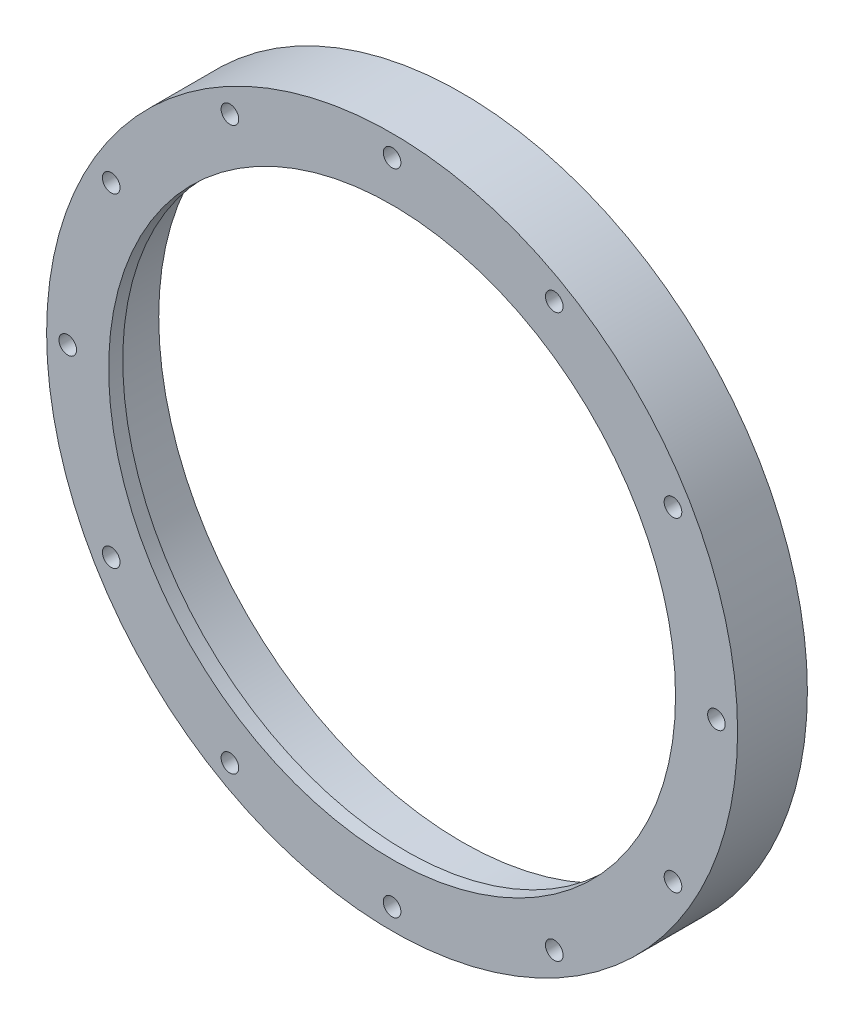
ISO-10303-21;
HEADER;
FILE_DESCRIPTION(('STEP AP214'),'2;1');
FILE_NAME('part.step','',(''),(''),'','','');
FILE_SCHEMA(('AUTOMOTIVE_DESIGN { 1 0 10303 214 1 1 1 1 }'));
ENDSEC;
DATA;
#1=APPLICATION_CONTEXT('core data for automotive mechanical design processes');
#2=APPLICATION_PROTOCOL_DEFINITION('international standard','automotive_design',2000,#1);
#3=PRODUCT_CONTEXT('',#1,'mechanical');
#4=PRODUCT('Part','Part','',(#3));
#5=PRODUCT_RELATED_PRODUCT_CATEGORY('part','',(#4));
#6=PRODUCT_DEFINITION_FORMATION('','',#4);
#7=PRODUCT_DEFINITION_CONTEXT('part definition',#1,'design');
#8=PRODUCT_DEFINITION('design','',#6,#7);
#9=PRODUCT_DEFINITION_SHAPE('','',#8);
#10=(LENGTH_UNIT() NAMED_UNIT(*) SI_UNIT(.MILLI.,.METRE.));
#11=(NAMED_UNIT(*) PLANE_ANGLE_UNIT() SI_UNIT($,.RADIAN.));
#12=(NAMED_UNIT(*) SI_UNIT($,.STERADIAN.) SOLID_ANGLE_UNIT());
#13=UNCERTAINTY_MEASURE_WITH_UNIT(LENGTH_MEASURE(1.E-05),#10,'distance_accuracy_value','');
#14=(GEOMETRIC_REPRESENTATION_CONTEXT(3) GLOBAL_UNCERTAINTY_ASSIGNED_CONTEXT((#13)) GLOBAL_UNIT_ASSIGNED_CONTEXT((#10,
#11,#12)) REPRESENTATION_CONTEXT('',''));
#15=CARTESIAN_POINT('',(0.,0.,0.));
#16=DIRECTION('',(0.,0.,1.));
#17=DIRECTION('',(1.,0.,0.));
#18=AXIS2_PLACEMENT_3D('',#15,#16,#17);
#19=CARTESIAN_POINT('',(0.,0.,0.));
#20=DIRECTION('',(0.,0.,1.));
#21=DIRECTION('',(1.,0.,0.));
#22=AXIS2_PLACEMENT_3D('',#19,#20,#21);
#23=PLANE('',#22);
#24=CARTESIAN_POINT('',(22.9999999999995,39.8371685740845,0.));
#25=DIRECTION('',(0.,0.,-1.));
#26=DIRECTION('',(-1.,0.,0.));
#27=AXIS2_PLACEMENT_3D('',#24,#25,#26);
#28=CIRCLE('',#27,1.24999999999999);
#29=CARTESIAN_POINT('',(21.7499999999995,39.8371685740845,0.));
#30=VERTEX_POINT('',#29);
#31=EDGE_CURVE('E166',#30,#30,#28,.T.);
#32=ORIENTED_EDGE('',*,*,#31,.F.);
#33=EDGE_LOOP('',(#32));
#34=FACE_BOUND('',#33,.T.);
#35=CARTESIAN_POINT('',(46.,4.81824424760352E-13,0.));
#36=DIRECTION('',(0.,0.,-1.));
#37=DIRECTION('',(-1.,0.,0.));
#38=AXIS2_PLACEMENT_3D('',#35,#36,#37);
#39=CIRCLE('',#38,1.24999999999999);
#40=CARTESIAN_POINT('',(44.75,4.81824424760352E-13,0.));
#41=VERTEX_POINT('',#40);
#42=EDGE_CURVE('E150',#41,#41,#39,.T.);
#43=ORIENTED_EDGE('',*,*,#42,.F.);
#44=EDGE_LOOP('',(#43));
#45=FACE_BOUND('',#44,.T.);
#46=CARTESIAN_POINT('',(0.,0.,0.));
#47=DIRECTION('',(0.,0.,1.));
#48=DIRECTION('',(1.,0.,0.));
#49=AXIS2_PLACEMENT_3D('',#46,#47,#48);
#50=CIRCLE('',#49,49.);
#51=CARTESIAN_POINT('',(49.,0.,0.));
#52=VERTEX_POINT('',#51);
#53=EDGE_CURVE('E10',#52,#52,#50,.T.);
#54=ORIENTED_EDGE('',*,*,#53,.F.);
#55=EDGE_LOOP('',(#54));
#56=FACE_BOUND('',#55,.T.);
#57=CARTESIAN_POINT('',(0.,0.,0.));
#58=DIRECTION('',(0.,0.,1.));
#59=DIRECTION('',(1.,0.,0.));
#60=AXIS2_PLACEMENT_3D('',#57,#58,#59);
#61=CIRCLE('',#60,43.);
#62=CARTESIAN_POINT('',(43.,0.,0.));
#63=VERTEX_POINT('',#62);
#64=EDGE_CURVE('E50',#63,#63,#61,.T.);
#65=ORIENTED_EDGE('',*,*,#64,.T.);
#66=EDGE_LOOP('',(#65));
#67=FACE_BOUND('',#66,.T.);
#68=CARTESIAN_POINT('',(0.,46.,0.));
#69=DIRECTION('',(0.,0.,-1.));
#70=DIRECTION('',(-1.,0.,0.));
#71=AXIS2_PLACEMENT_3D('',#68,#69,#70);
#72=CIRCLE('',#71,1.24999999999999);
#73=CARTESIAN_POINT('',(-1.24999999999999,46.,0.));
#74=VERTEX_POINT('',#73);
#75=EDGE_CURVE('E79',#74,#74,#72,.T.);
#76=ORIENTED_EDGE('',*,*,#75,.F.);
#77=EDGE_LOOP('',(#76));
#78=FACE_BOUND('',#77,.T.);
#79=CARTESIAN_POINT('',(-23.,39.8371685740841,0.));
#80=DIRECTION('',(0.,0.,-1.));
#81=DIRECTION('',(-1.,0.,0.));
#82=AXIS2_PLACEMENT_3D('',#79,#80,#81);
#83=CIRCLE('',#82,1.24999999999999);
#84=CARTESIAN_POINT('',(-24.25,39.8371685740841,0.));
#85=VERTEX_POINT('',#84);
#86=EDGE_CURVE('E87',#85,#85,#83,.T.);
#87=ORIENTED_EDGE('',*,*,#86,.F.);
#88=EDGE_LOOP('',(#87));
#89=FACE_BOUND('',#88,.T.);
#90=CARTESIAN_POINT('',(-39.8371685740842,22.9999999999999,0.));
#91=DIRECTION('',(0.,0.,-1.));
#92=DIRECTION('',(-1.,0.,0.));
#93=AXIS2_PLACEMENT_3D('',#90,#91,#92);
#94=CIRCLE('',#93,1.24999999999999);
#95=CARTESIAN_POINT('',(-41.0871685740842,22.9999999999999,0.));
#96=VERTEX_POINT('',#95);
#97=EDGE_CURVE('E95',#96,#96,#94,.T.);
#98=ORIENTED_EDGE('',*,*,#97,.F.);
#99=EDGE_LOOP('',(#98));
#100=FACE_BOUND('',#99,.T.);
#101=CARTESIAN_POINT('',(-46.,-1.60608141586784E-13,0.));
#102=DIRECTION('',(0.,0.,-1.));
#103=DIRECTION('',(-1.,0.,0.));
#104=AXIS2_PLACEMENT_3D('',#101,#102,#103);
#105=CIRCLE('',#104,1.24999999999999);
#106=CARTESIAN_POINT('',(-47.25,-1.60608141586784E-13,0.));
#107=VERTEX_POINT('',#106);
#108=EDGE_CURVE('E103',#107,#107,#105,.T.);
#109=ORIENTED_EDGE('',*,*,#108,.F.);
#110=EDGE_LOOP('',(#109));
#111=FACE_BOUND('',#110,.T.);
#112=CARTESIAN_POINT('',(-39.8371685740841,-23.0000000000002,0.));
#113=DIRECTION('',(0.,0.,-1.));
#114=DIRECTION('',(-1.,0.,0.));
#115=AXIS2_PLACEMENT_3D('',#112,#113,#114);
#116=CIRCLE('',#115,1.24999999999999);
#117=CARTESIAN_POINT('',(-41.0871685740841,-23.0000000000002,0.));
#118=VERTEX_POINT('',#117);
#119=EDGE_CURVE('E111',#118,#118,#116,.T.);
#120=ORIENTED_EDGE('',*,*,#119,.F.);
#121=EDGE_LOOP('',(#120));
#122=FACE_BOUND('',#121,.T.);
#123=CARTESIAN_POINT('',(-22.9999999999998,-39.8371685740843,0.));
#124=DIRECTION('',(0.,0.,-1.));
#125=DIRECTION('',(-1.,0.,0.));
#126=AXIS2_PLACEMENT_3D('',#123,#124,#125);
#127=CIRCLE('',#126,1.24999999999999);
#128=CARTESIAN_POINT('',(-24.2499999999998,-39.8371685740843,0.));
#129=VERTEX_POINT('',#128);
#130=EDGE_CURVE('E119',#129,#129,#127,.T.);
#131=ORIENTED_EDGE('',*,*,#130,.F.);
#132=EDGE_LOOP('',(#131));
#133=FACE_BOUND('',#132,.T.);
#134=CARTESIAN_POINT('',(0.,-46.,0.));
#135=DIRECTION('',(0.,0.,-1.));
#136=DIRECTION('',(-1.,0.,0.));
#137=AXIS2_PLACEMENT_3D('',#134,#135,#136);
#138=CIRCLE('',#137,1.24999999999999);
#139=CARTESIAN_POINT('',(-1.24999999999999,-46.,0.));
#140=VERTEX_POINT('',#139);
#141=EDGE_CURVE('E127',#140,#140,#138,.T.);
#142=ORIENTED_EDGE('',*,*,#141,.F.);
#143=EDGE_LOOP('',(#142));
#144=FACE_BOUND('',#143,.T.);
#145=CARTESIAN_POINT('',(23.0000000000003,-39.837168574084,0.));
#146=DIRECTION('',(0.,0.,-1.));
#147=DIRECTION('',(-1.,0.,0.));
#148=AXIS2_PLACEMENT_3D('',#145,#146,#147);
#149=CIRCLE('',#148,1.24999999999999);
#150=CARTESIAN_POINT('',(21.7500000000003,-39.837168574084,0.));
#151=VERTEX_POINT('',#150);
#152=EDGE_CURVE('E135',#151,#151,#149,.T.);
#153=ORIENTED_EDGE('',*,*,#152,.F.);
#154=EDGE_LOOP('',(#153));
#155=FACE_BOUND('',#154,.T.);
#156=CARTESIAN_POINT('',(39.8371685740844,-22.9999999999996,0.));
#157=DIRECTION('',(0.,0.,-1.));
#158=DIRECTION('',(-1.,0.,0.));
#159=AXIS2_PLACEMENT_3D('',#156,#157,#158);
#160=CIRCLE('',#159,1.24999999999999);
#161=CARTESIAN_POINT('',(38.5871685740844,-22.9999999999996,0.));
#162=VERTEX_POINT('',#161);
#163=EDGE_CURVE('E142',#162,#162,#160,.T.);
#164=ORIENTED_EDGE('',*,*,#163,.F.);
#165=EDGE_LOOP('',(#164));
#166=FACE_BOUND('',#165,.T.);
#167=CARTESIAN_POINT('',(39.8371685740839,23.0000000000005,0.));
#168=DIRECTION('',(0.,0.,-1.));
#169=DIRECTION('',(-1.,0.,0.));
#170=AXIS2_PLACEMENT_3D('',#167,#168,#169);
#171=CIRCLE('',#170,1.24999999999999);
#172=CARTESIAN_POINT('',(38.5871685740839,23.0000000000005,0.));
#173=VERTEX_POINT('',#172);
#174=EDGE_CURVE('E158',#173,#173,#171,.T.);
#175=ORIENTED_EDGE('',*,*,#174,.F.);
#176=EDGE_LOOP('',(#175));
#177=FACE_BOUND('',#176,.T.);
#178=ADVANCED_FACE('F42',(#34,#45,#56,#67,#78,#89,#100,#111,#122,#133,#144,#155,#166,#177),#23,.F.);
#179=CARTESIAN_POINT('',(0.,0.,7.9));
#180=DIRECTION('',(0.,0.,-1.));
#181=DIRECTION('',(-1.,0.,0.));
#182=AXIS2_PLACEMENT_3D('',#179,#180,#181);
#183=CYLINDRICAL_SURFACE('',#182,49.);
#184=ORIENTED_EDGE('',*,*,#53,.T.);
#185=EDGE_LOOP('',(#184));
#186=FACE_BOUND('',#185,.T.);
#187=CARTESIAN_POINT('',(0.,0.,9.9));
#188=DIRECTION('',(0.,0.,1.));
#189=DIRECTION('',(1.,0.,0.));
#190=AXIS2_PLACEMENT_3D('',#187,#188,#189);
#191=CIRCLE('',#190,49.);
#192=CARTESIAN_POINT('',(49.,0.,9.9));
#193=VERTEX_POINT('',#192);
#194=EDGE_CURVE('E62',#193,#193,#191,.T.);
#195=ORIENTED_EDGE('',*,*,#194,.F.);
#196=EDGE_LOOP('',(#195));
#197=FACE_BOUND('',#196,.T.);
#198=ADVANCED_FACE('F44',(#186,#197),#183,.T.);
#199=CARTESIAN_POINT('',(0.,0.,7.9));
#200=DIRECTION('',(0.,0.,-1.));
#201=DIRECTION('',(-1.,0.,0.));
#202=AXIS2_PLACEMENT_3D('',#199,#200,#201);
#203=CYLINDRICAL_SURFACE('',#202,43.);
#204=CARTESIAN_POINT('',(0.,0.,7.9));
#205=DIRECTION('',(0.,0.,1.));
#206=DIRECTION('',(1.,0.,0.));
#207=AXIS2_PLACEMENT_3D('',#204,#205,#206);
#208=CIRCLE('',#207,43.);
#209=CARTESIAN_POINT('',(43.,0.,7.9));
#210=VERTEX_POINT('',#209);
#211=EDGE_CURVE('E56',#210,#210,#208,.T.);
#212=ORIENTED_EDGE('',*,*,#211,.T.);
#213=EDGE_LOOP('',(#212));
#214=FACE_BOUND('',#213,.T.);
#215=ORIENTED_EDGE('',*,*,#64,.F.);
#216=EDGE_LOOP('',(#215));
#217=FACE_BOUND('',#216,.T.);
#218=ADVANCED_FACE('F245',(#214,#217),#203,.F.);
#219=CARTESIAN_POINT('',(0.,0.,7.9));
#220=DIRECTION('',(0.,0.,1.));
#221=DIRECTION('',(1.,0.,0.));
#222=AXIS2_PLACEMENT_3D('',#219,#220,#221);
#223=PLANE('',#222);
#224=CARTESIAN_POINT('',(0.,0.,7.9));
#225=DIRECTION('',(0.,0.,1.));
#226=DIRECTION('',(1.,0.,0.));
#227=AXIS2_PLACEMENT_3D('',#224,#225,#226);
#228=CIRCLE('',#227,40.2);
#229=CARTESIAN_POINT('',(40.2,0.,7.9));
#230=VERTEX_POINT('',#229);
#231=EDGE_CURVE('E69',#230,#230,#228,.T.);
#232=ORIENTED_EDGE('',*,*,#231,.T.);
#233=EDGE_LOOP('',(#232));
#234=FACE_BOUND('',#233,.T.);
#235=ORIENTED_EDGE('',*,*,#211,.F.);
#236=EDGE_LOOP('',(#235));
#237=FACE_BOUND('',#236,.T.);
#238=ADVANCED_FACE('F210',(#234,#237),#223,.F.);
#239=CARTESIAN_POINT('',(0.,0.,9.9));
#240=DIRECTION('',(0.,0.,1.));
#241=DIRECTION('',(1.,0.,0.));
#242=AXIS2_PLACEMENT_3D('',#239,#240,#241);
#243=PLANE('',#242);
#244=CARTESIAN_POINT('',(22.9999999999995,39.8371685740845,9.9));
#245=DIRECTION('',(0.,0.,1.));
#246=DIRECTION('',(1.,0.,0.));
#247=AXIS2_PLACEMENT_3D('',#244,#245,#246);
#248=CIRCLE('',#247,1.24999999999999);
#249=CARTESIAN_POINT('',(24.2499999999995,39.8371685740845,9.9));
#250=VERTEX_POINT('',#249);
#251=EDGE_CURVE('E162',#250,#250,#248,.T.);
#252=ORIENTED_EDGE('',*,*,#251,.F.);
#253=EDGE_LOOP('',(#252));
#254=FACE_BOUND('',#253,.T.);
#255=CARTESIAN_POINT('',(39.8371685740839,23.0000000000005,9.9));
#256=DIRECTION('',(0.,0.,1.));
#257=DIRECTION('',(1.,0.,0.));
#258=AXIS2_PLACEMENT_3D('',#255,#256,#257);
#259=CIRCLE('',#258,1.24999999999999);
#260=CARTESIAN_POINT('',(41.0871685740839,23.0000000000005,9.9));
#261=VERTEX_POINT('',#260);
#262=EDGE_CURVE('E154',#261,#261,#259,.T.);
#263=ORIENTED_EDGE('',*,*,#262,.F.);
#264=EDGE_LOOP('',(#263));
#265=FACE_BOUND('',#264,.T.);
#266=CARTESIAN_POINT('',(46.,4.81824424760352E-13,9.9));
#267=DIRECTION('',(0.,0.,1.));
#268=DIRECTION('',(1.,0.,0.));
#269=AXIS2_PLACEMENT_3D('',#266,#267,#268);
#270=CIRCLE('',#269,1.24999999999999);
#271=CARTESIAN_POINT('',(47.25,4.81824424760352E-13,9.9));
#272=VERTEX_POINT('',#271);
#273=EDGE_CURVE('E146',#272,#272,#270,.T.);
#274=ORIENTED_EDGE('',*,*,#273,.F.);
#275=EDGE_LOOP('',(#274));
#276=FACE_BOUND('',#275,.T.);
#277=CARTESIAN_POINT('',(39.8371685740844,-22.9999999999996,9.9));
#278=DIRECTION('',(0.,0.,1.));
#279=DIRECTION('',(1.,0.,0.));
#280=AXIS2_PLACEMENT_3D('',#277,#278,#279);
#281=CIRCLE('',#280,1.24999999999999);
#282=CARTESIAN_POINT('',(41.0871685740844,-22.9999999999996,9.9));
#283=VERTEX_POINT('',#282);
#284=EDGE_CURVE('E138',#283,#283,#281,.T.);
#285=ORIENTED_EDGE('',*,*,#284,.F.);
#286=EDGE_LOOP('',(#285));
#287=FACE_BOUND('',#286,.T.);
#288=CARTESIAN_POINT('',(23.0000000000003,-39.837168574084,9.9));
#289=DIRECTION('',(0.,0.,1.));
#290=DIRECTION('',(1.,0.,0.));
#291=AXIS2_PLACEMENT_3D('',#288,#289,#290);
#292=CIRCLE('',#291,1.24999999999999);
#293=CARTESIAN_POINT('',(24.2500000000003,-39.837168574084,9.9));
#294=VERTEX_POINT('',#293);
#295=EDGE_CURVE('E131',#294,#294,#292,.T.);
#296=ORIENTED_EDGE('',*,*,#295,.F.);
#297=EDGE_LOOP('',(#296));
#298=FACE_BOUND('',#297,.T.);
#299=CARTESIAN_POINT('',(0.,-46.,9.9));
#300=DIRECTION('',(0.,0.,1.));
#301=DIRECTION('',(1.,0.,0.));
#302=AXIS2_PLACEMENT_3D('',#299,#300,#301);
#303=CIRCLE('',#302,1.24999999999999);
#304=CARTESIAN_POINT('',(1.24999999999999,-46.,9.9));
#305=VERTEX_POINT('',#304);
#306=EDGE_CURVE('E123',#305,#305,#303,.T.);
#307=ORIENTED_EDGE('',*,*,#306,.F.);
#308=EDGE_LOOP('',(#307));
#309=FACE_BOUND('',#308,.T.);
#310=CARTESIAN_POINT('',(-22.9999999999998,-39.8371685740843,9.9));
#311=DIRECTION('',(0.,0.,1.));
#312=DIRECTION('',(1.,0.,0.));
#313=AXIS2_PLACEMENT_3D('',#310,#311,#312);
#314=CIRCLE('',#313,1.24999999999999);
#315=CARTESIAN_POINT('',(-21.7499999999998,-39.8371685740843,9.9));
#316=VERTEX_POINT('',#315);
#317=EDGE_CURVE('E115',#316,#316,#314,.T.);
#318=ORIENTED_EDGE('',*,*,#317,.F.);
#319=EDGE_LOOP('',(#318));
#320=FACE_BOUND('',#319,.T.);
#321=CARTESIAN_POINT('',(-39.8371685740841,-23.0000000000002,9.9));
#322=DIRECTION('',(0.,0.,1.));
#323=DIRECTION('',(1.,0.,0.));
#324=AXIS2_PLACEMENT_3D('',#321,#322,#323);
#325=CIRCLE('',#324,1.24999999999999);
#326=CARTESIAN_POINT('',(-38.5871685740841,-23.0000000000002,9.9));
#327=VERTEX_POINT('',#326);
#328=EDGE_CURVE('E107',#327,#327,#325,.T.);
#329=ORIENTED_EDGE('',*,*,#328,.F.);
#330=EDGE_LOOP('',(#329));
#331=FACE_BOUND('',#330,.T.);
#332=CARTESIAN_POINT('',(-46.,-1.60608141586784E-13,9.9));
#333=DIRECTION('',(0.,0.,1.));
#334=DIRECTION('',(1.,0.,0.));
#335=AXIS2_PLACEMENT_3D('',#332,#333,#334);
#336=CIRCLE('',#335,1.24999999999999);
#337=CARTESIAN_POINT('',(-44.75,-1.60608141586784E-13,9.9));
#338=VERTEX_POINT('',#337);
#339=EDGE_CURVE('E99',#338,#338,#336,.T.);
#340=ORIENTED_EDGE('',*,*,#339,.F.);
#341=EDGE_LOOP('',(#340));
#342=FACE_BOUND('',#341,.T.);
#343=CARTESIAN_POINT('',(-39.8371685740842,22.9999999999999,9.9));
#344=DIRECTION('',(0.,0.,1.));
#345=DIRECTION('',(1.,0.,0.));
#346=AXIS2_PLACEMENT_3D('',#343,#344,#345);
#347=CIRCLE('',#346,1.24999999999999);
#348=CARTESIAN_POINT('',(-38.5871685740842,22.9999999999999,9.9));
#349=VERTEX_POINT('',#348);
#350=EDGE_CURVE('E91',#349,#349,#347,.T.);
#351=ORIENTED_EDGE('',*,*,#350,.F.);
#352=EDGE_LOOP('',(#351));
#353=FACE_BOUND('',#352,.T.);
#354=CARTESIAN_POINT('',(-23.,39.8371685740841,9.9));
#355=DIRECTION('',(0.,0.,1.));
#356=DIRECTION('',(1.,0.,0.));
#357=AXIS2_PLACEMENT_3D('',#354,#355,#356);
#358=CIRCLE('',#357,1.24999999999999);
#359=CARTESIAN_POINT('',(-21.7500000000001,39.8371685740841,9.9));
#360=VERTEX_POINT('',#359);
#361=EDGE_CURVE('E83',#360,#360,#358,.T.);
#362=ORIENTED_EDGE('',*,*,#361,.F.);
#363=EDGE_LOOP('',(#362));
#364=FACE_BOUND('',#363,.T.);
#365=CARTESIAN_POINT('',(0.,46.,9.9));
#366=DIRECTION('',(0.,0.,1.));
#367=DIRECTION('',(1.,0.,0.));
#368=AXIS2_PLACEMENT_3D('',#365,#366,#367);
#369=CIRCLE('',#368,1.24999999999999);
#370=CARTESIAN_POINT('',(1.24999999999999,46.,9.9));
#371=VERTEX_POINT('',#370);
#372=EDGE_CURVE('E73',#371,#371,#369,.T.);
#373=ORIENTED_EDGE('',*,*,#372,.F.);
#374=EDGE_LOOP('',(#373));
#375=FACE_BOUND('',#374,.T.);
#376=ORIENTED_EDGE('',*,*,#194,.T.);
#377=EDGE_LOOP('',(#376));
#378=FACE_BOUND('',#377,.T.);
#379=CARTESIAN_POINT('',(0.,0.,9.9));
#380=DIRECTION('',(0.,0.,1.));
#381=DIRECTION('',(1.,0.,0.));
#382=AXIS2_PLACEMENT_3D('',#379,#380,#381);
#383=CIRCLE('',#382,40.2);
#384=CARTESIAN_POINT('',(40.2,0.,9.9));
#385=VERTEX_POINT('',#384);
#386=EDGE_CURVE('E68',#385,#385,#383,.T.);
#387=ORIENTED_EDGE('',*,*,#386,.F.);
#388=EDGE_LOOP('',(#387));
#389=FACE_BOUND('',#388,.T.);
#390=ADVANCED_FACE('F206',(#254,#265,#276,#287,#298,#309,#320,#331,#342,#353,#364,#375,#378,
#389),#243,.T.);
#391=CARTESIAN_POINT('',(0.,0.,9.9));
#392=DIRECTION('',(0.,0.,-1.));
#393=DIRECTION('',(-1.,0.,0.));
#394=AXIS2_PLACEMENT_3D('',#391,#392,#393);
#395=CYLINDRICAL_SURFACE('',#394,40.2);
#396=ORIENTED_EDGE('',*,*,#386,.T.);
#397=EDGE_LOOP('',(#396));
#398=FACE_BOUND('',#397,.T.);
#399=ORIENTED_EDGE('',*,*,#231,.F.);
#400=EDGE_LOOP('',(#399));
#401=FACE_BOUND('',#400,.T.);
#402=ADVANCED_FACE('F209',(#398,#401),#395,.F.);
#403=CARTESIAN_POINT('',(0.,46.,0.));
#404=DIRECTION('',(0.,0.,-1.));
#405=DIRECTION('',(-1.,0.,0.));
#406=AXIS2_PLACEMENT_3D('',#403,#404,#405);
#407=CYLINDRICAL_SURFACE('',#406,1.24999999999999);
#408=ORIENTED_EDGE('',*,*,#75,.T.);
#409=EDGE_LOOP('',(#408));
#410=FACE_BOUND('',#409,.T.);
#411=ORIENTED_EDGE('',*,*,#372,.T.);
#412=EDGE_LOOP('',(#411));
#413=FACE_BOUND('',#412,.T.);
#414=ADVANCED_FACE('F239',(#410,#413),#407,.F.);
#415=CARTESIAN_POINT('',(-23.,39.8371685740841,0.));
#416=DIRECTION('',(0.,0.,-1.));
#417=DIRECTION('',(-1.,0.,0.));
#418=AXIS2_PLACEMENT_3D('',#415,#416,#417);
#419=CYLINDRICAL_SURFACE('',#418,1.24999999999999);
#420=ORIENTED_EDGE('',*,*,#86,.T.);
#421=EDGE_LOOP('',(#420));
#422=FACE_BOUND('',#421,.T.);
#423=ORIENTED_EDGE('',*,*,#361,.T.);
#424=EDGE_LOOP('',(#423));
#425=FACE_BOUND('',#424,.T.);
#426=ADVANCED_FACE('F258',(#422,#425),#419,.F.);
#427=CARTESIAN_POINT('',(-39.8371685740842,22.9999999999999,0.));
#428=DIRECTION('',(0.,0.,-1.));
#429=DIRECTION('',(-1.,0.,0.));
#430=AXIS2_PLACEMENT_3D('',#427,#428,#429);
#431=CYLINDRICAL_SURFACE('',#430,1.24999999999999);
#432=ORIENTED_EDGE('',*,*,#97,.T.);
#433=EDGE_LOOP('',(#432));
#434=FACE_BOUND('',#433,.T.);
#435=ORIENTED_EDGE('',*,*,#350,.T.);
#436=EDGE_LOOP('',(#435));
#437=FACE_BOUND('',#436,.T.);
#438=ADVANCED_FACE('F262',(#434,#437),#431,.F.);
#439=CARTESIAN_POINT('',(-46.,-1.60608141586784E-13,0.));
#440=DIRECTION('',(0.,0.,-1.));
#441=DIRECTION('',(-1.,0.,0.));
#442=AXIS2_PLACEMENT_3D('',#439,#440,#441);
#443=CYLINDRICAL_SURFACE('',#442,1.24999999999999);
#444=ORIENTED_EDGE('',*,*,#108,.T.);
#445=EDGE_LOOP('',(#444));
#446=FACE_BOUND('',#445,.T.);
#447=ORIENTED_EDGE('',*,*,#339,.T.);
#448=EDGE_LOOP('',(#447));
#449=FACE_BOUND('',#448,.T.);
#450=ADVANCED_FACE('F266',(#446,#449),#443,.F.);
#451=CARTESIAN_POINT('',(-39.8371685740841,-23.0000000000002,0.));
#452=DIRECTION('',(0.,0.,-1.));
#453=DIRECTION('',(-1.,0.,0.));
#454=AXIS2_PLACEMENT_3D('',#451,#452,#453);
#455=CYLINDRICAL_SURFACE('',#454,1.24999999999999);
#456=ORIENTED_EDGE('',*,*,#119,.T.);
#457=EDGE_LOOP('',(#456));
#458=FACE_BOUND('',#457,.T.);
#459=ORIENTED_EDGE('',*,*,#328,.T.);
#460=EDGE_LOOP('',(#459));
#461=FACE_BOUND('',#460,.T.);
#462=ADVANCED_FACE('F270',(#458,#461),#455,.F.);
#463=CARTESIAN_POINT('',(-22.9999999999998,-39.8371685740843,0.));
#464=DIRECTION('',(0.,0.,-1.));
#465=DIRECTION('',(-1.,0.,0.));
#466=AXIS2_PLACEMENT_3D('',#463,#464,#465);
#467=CYLINDRICAL_SURFACE('',#466,1.24999999999999);
#468=ORIENTED_EDGE('',*,*,#130,.T.);
#469=EDGE_LOOP('',(#468));
#470=FACE_BOUND('',#469,.T.);
#471=ORIENTED_EDGE('',*,*,#317,.T.);
#472=EDGE_LOOP('',(#471));
#473=FACE_BOUND('',#472,.T.);
#474=ADVANCED_FACE('F274',(#470,#473),#467,.F.);
#475=CARTESIAN_POINT('',(0.,-46.,0.));
#476=DIRECTION('',(0.,0.,-1.));
#477=DIRECTION('',(-1.,0.,0.));
#478=AXIS2_PLACEMENT_3D('',#475,#476,#477);
#479=CYLINDRICAL_SURFACE('',#478,1.24999999999999);
#480=ORIENTED_EDGE('',*,*,#141,.T.);
#481=EDGE_LOOP('',(#480));
#482=FACE_BOUND('',#481,.T.);
#483=ORIENTED_EDGE('',*,*,#306,.T.);
#484=EDGE_LOOP('',(#483));
#485=FACE_BOUND('',#484,.T.);
#486=ADVANCED_FACE('F278',(#482,#485),#479,.F.);
#487=CARTESIAN_POINT('',(23.0000000000003,-39.837168574084,0.));
#488=DIRECTION('',(0.,0.,-1.));
#489=DIRECTION('',(-1.,0.,0.));
#490=AXIS2_PLACEMENT_3D('',#487,#488,#489);
#491=CYLINDRICAL_SURFACE('',#490,1.24999999999999);
#492=ORIENTED_EDGE('',*,*,#152,.T.);
#493=EDGE_LOOP('',(#492));
#494=FACE_BOUND('',#493,.T.);
#495=ORIENTED_EDGE('',*,*,#295,.T.);
#496=EDGE_LOOP('',(#495));
#497=FACE_BOUND('',#496,.T.);
#498=ADVANCED_FACE('F282',(#494,#497),#491,.F.);
#499=CARTESIAN_POINT('',(39.8371685740844,-22.9999999999996,0.));
#500=DIRECTION('',(0.,0.,-1.));
#501=DIRECTION('',(-1.,0.,0.));
#502=AXIS2_PLACEMENT_3D('',#499,#500,#501);
#503=CYLINDRICAL_SURFACE('',#502,1.24999999999999);
#504=ORIENTED_EDGE('',*,*,#163,.T.);
#505=EDGE_LOOP('',(#504));
#506=FACE_BOUND('',#505,.T.);
#507=ORIENTED_EDGE('',*,*,#284,.T.);
#508=EDGE_LOOP('',(#507));
#509=FACE_BOUND('',#508,.T.);
#510=ADVANCED_FACE('F286',(#506,#509),#503,.F.);
#511=CARTESIAN_POINT('',(46.,4.81824424760352E-13,0.));
#512=DIRECTION('',(0.,0.,-1.));
#513=DIRECTION('',(-1.,0.,0.));
#514=AXIS2_PLACEMENT_3D('',#511,#512,#513);
#515=CYLINDRICAL_SURFACE('',#514,1.24999999999999);
#516=ORIENTED_EDGE('',*,*,#42,.T.);
#517=EDGE_LOOP('',(#516));
#518=FACE_BOUND('',#517,.T.);
#519=ORIENTED_EDGE('',*,*,#273,.T.);
#520=EDGE_LOOP('',(#519));
#521=FACE_BOUND('',#520,.T.);
#522=ADVANCED_FACE('F202',(#518,#521),#515,.F.);
#523=CARTESIAN_POINT('',(39.8371685740839,23.0000000000005,0.));
#524=DIRECTION('',(0.,0.,-1.));
#525=DIRECTION('',(-1.,0.,0.));
#526=AXIS2_PLACEMENT_3D('',#523,#524,#525);
#527=CYLINDRICAL_SURFACE('',#526,1.24999999999999);
#528=ORIENTED_EDGE('',*,*,#174,.T.);
#529=EDGE_LOOP('',(#528));
#530=FACE_BOUND('',#529,.T.);
#531=ORIENTED_EDGE('',*,*,#262,.T.);
#532=EDGE_LOOP('',(#531));
#533=FACE_BOUND('',#532,.T.);
#534=ADVANCED_FACE('F199',(#530,#533),#527,.F.);
#535=CARTESIAN_POINT('',(22.9999999999995,39.8371685740845,0.));
#536=DIRECTION('',(0.,0.,-1.));
#537=DIRECTION('',(-1.,0.,0.));
#538=AXIS2_PLACEMENT_3D('',#535,#536,#537);
#539=CYLINDRICAL_SURFACE('',#538,1.24999999999999);
#540=ORIENTED_EDGE('',*,*,#31,.T.);
#541=EDGE_LOOP('',(#540));
#542=FACE_BOUND('',#541,.T.);
#543=ORIENTED_EDGE('',*,*,#251,.T.);
#544=EDGE_LOOP('',(#543));
#545=FACE_BOUND('',#544,.T.);
#546=ADVANCED_FACE('F171',(#542,#545),#539,.F.);
#547=CLOSED_SHELL('',(#178,#198,#218,#238,#390,#402,#414,#426,#438,#450,#462,#474,#486,#498,
#510,#522,#534,#546));
#548=MANIFOLD_SOLID_BREP('B2',#547);
#549=ADVANCED_BREP_SHAPE_REPRESENTATION('',(#18,#548),#14);
#550=SHAPE_DEFINITION_REPRESENTATION(#9,#549);
ENDSEC;
END-ISO-10303-21;
